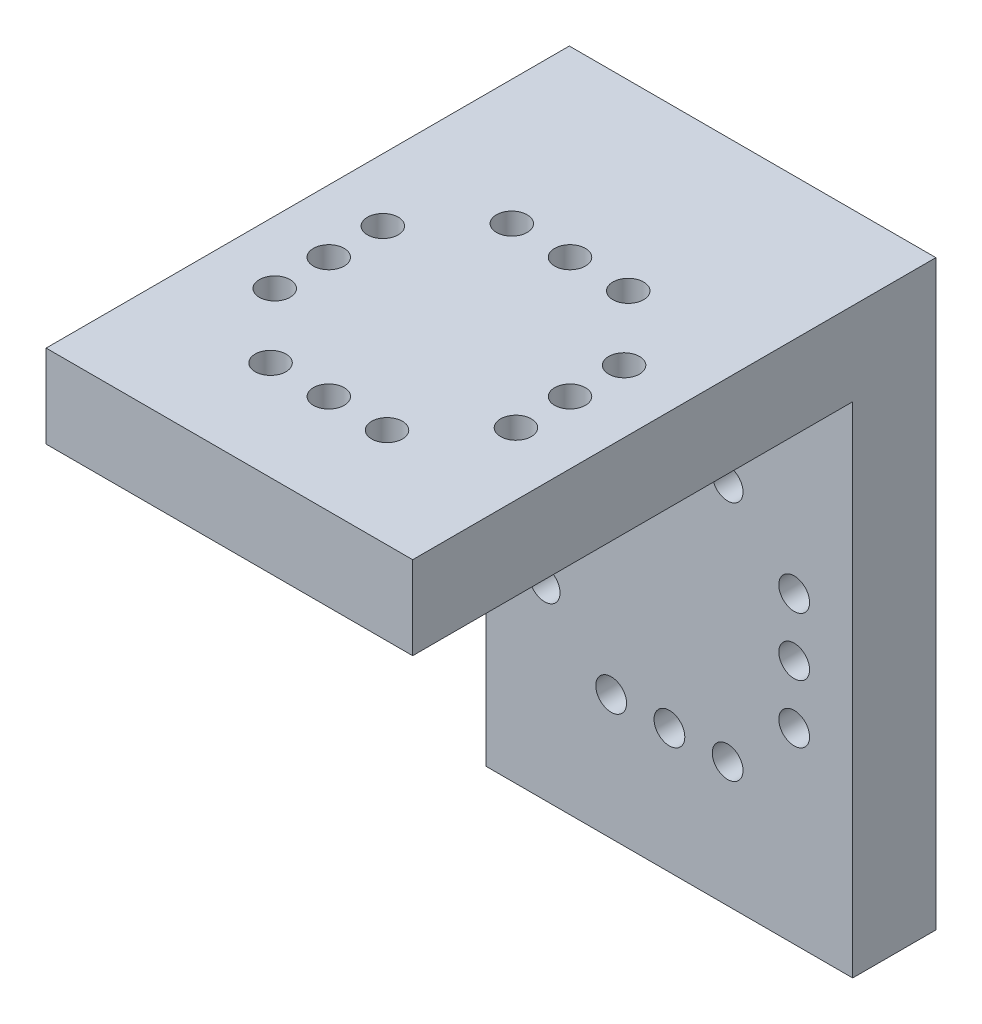
ISO-10303-21;
HEADER;
FILE_DESCRIPTION(('STEP AP214'),'2;1');
FILE_NAME('part.step','',(''),(''),'','','');
FILE_SCHEMA(('AUTOMOTIVE_DESIGN { 1 0 10303 214 1 1 1 1 }'));
ENDSEC;
DATA;
#1=APPLICATION_CONTEXT('core data for automotive mechanical design processes');
#2=APPLICATION_PROTOCOL_DEFINITION('international standard','automotive_design',2000,#1);
#3=PRODUCT_CONTEXT('',#1,'mechanical');
#4=PRODUCT('Part','Part','',(#3));
#5=PRODUCT_RELATED_PRODUCT_CATEGORY('part','',(#4));
#6=PRODUCT_DEFINITION_FORMATION('','',#4);
#7=PRODUCT_DEFINITION_CONTEXT('part definition',#1,'design');
#8=PRODUCT_DEFINITION('design','',#6,#7);
#9=PRODUCT_DEFINITION_SHAPE('','',#8);
#10=(LENGTH_UNIT() NAMED_UNIT(*) SI_UNIT(.MILLI.,.METRE.));
#11=(NAMED_UNIT(*) PLANE_ANGLE_UNIT() SI_UNIT($,.RADIAN.));
#12=(NAMED_UNIT(*) SI_UNIT($,.STERADIAN.) SOLID_ANGLE_UNIT());
#13=UNCERTAINTY_MEASURE_WITH_UNIT(LENGTH_MEASURE(1.E-05),#10,'distance_accuracy_value','');
#14=(GEOMETRIC_REPRESENTATION_CONTEXT(3) GLOBAL_UNCERTAINTY_ASSIGNED_CONTEXT((#13)) GLOBAL_UNIT_ASSIGNED_CONTEXT((#10,
#11,#12)) REPRESENTATION_CONTEXT('',''));
#15=CARTESIAN_POINT('',(0.,0.,0.));
#16=DIRECTION('',(0.,0.,1.));
#17=DIRECTION('',(1.,0.,0.));
#18=AXIS2_PLACEMENT_3D('',#15,#16,#17);
#19=CARTESIAN_POINT('',(-11.016510741559,-5.,0.));
#20=DIRECTION('',(1.,0.,0.));
#21=DIRECTION('',(0.,0.,-1.));
#22=AXIS2_PLACEMENT_3D('',#19,#20,#21);
#23=PLANE('',#22);
#24=DIRECTION('',(0.,0.,-1.));
#25=VECTOR('',#24,1.);
#26=CARTESIAN_POINT('',(-11.016510741559,0.,0.));
#27=LINE('',#26,#25);
#28=CARTESIAN_POINT('',(-11.016510741559,0.,13.224550376675));
#29=VERTEX_POINT('',#28);
#30=CARTESIAN_POINT('',(-11.016510741559,0.,-18.224550376675));
#31=VERTEX_POINT('',#30);
#32=EDGE_CURVE('E140',#29,#31,#27,.T.);
#33=ORIENTED_EDGE('',*,*,#32,.T.);
#34=DIRECTION('',(0.,1.,0.));
#35=VECTOR('',#34,1.);
#36=CARTESIAN_POINT('',(-11.016510741559,-35.,-18.224550376675));
#37=LINE('',#36,#35);
#38=CARTESIAN_POINT('',(-11.016510741559,-35.,-18.224550376675));
#39=VERTEX_POINT('',#38);
#40=EDGE_CURVE('E219',#39,#31,#37,.T.);
#41=ORIENTED_EDGE('',*,*,#40,.F.);
#42=DIRECTION('',(0.,0.,-1.));
#43=VECTOR('',#42,1.);
#44=CARTESIAN_POINT('',(-11.016510741559,-35.,0.));
#45=LINE('',#44,#43);
#46=CARTESIAN_POINT('',(-11.016510741559,-35.,-13.224550376675));
#47=VERTEX_POINT('',#46);
#48=EDGE_CURVE('E216',#47,#39,#45,.T.);
#49=ORIENTED_EDGE('',*,*,#48,.F.);
#50=DIRECTION('',(0.,1.,0.));
#51=VECTOR('',#50,1.);
#52=CARTESIAN_POINT('',(-11.016510741559,-35.,-13.224550376675));
#53=LINE('',#52,#51);
#54=CARTESIAN_POINT('',(-11.016510741559,-5.,-13.224550376675));
#55=VERTEX_POINT('',#54);
#56=EDGE_CURVE('E94',#47,#55,#53,.T.);
#57=ORIENTED_EDGE('',*,*,#56,.T.);
#58=DIRECTION('',(0.,0.,-1.));
#59=VECTOR('',#58,1.);
#60=CARTESIAN_POINT('',(-11.016510741559,-5.,0.));
#61=LINE('',#60,#59);
#62=CARTESIAN_POINT('',(-11.016510741559,-5.,13.224550376675));
#63=VERTEX_POINT('',#62);
#64=EDGE_CURVE('E73',#63,#55,#61,.T.);
#65=ORIENTED_EDGE('',*,*,#64,.F.);
#66=DIRECTION('',(0.,1.,0.));
#67=VECTOR('',#66,1.);
#68=CARTESIAN_POINT('',(-11.016510741559,-5.,13.224550376675));
#69=LINE('',#68,#67);
#70=EDGE_CURVE('E45',#63,#29,#69,.T.);
#71=ORIENTED_EDGE('',*,*,#70,.T.);
#72=EDGE_LOOP('',(#33,#41,#49,#57,#65,#71));
#73=FACE_BOUND('',#72,.T.);
#74=ADVANCED_FACE('F35',(#73),#23,.F.);
#75=CARTESIAN_POINT('',(11.016510741559,-5.,0.));
#76=DIRECTION('',(1.,0.,0.));
#77=DIRECTION('',(0.,0.,-1.));
#78=AXIS2_PLACEMENT_3D('',#75,#76,#77);
#79=PLANE('',#78);
#80=DIRECTION('',(0.,0.,-1.));
#81=VECTOR('',#80,1.);
#82=CARTESIAN_POINT('',(11.016510741559,0.,0.));
#83=LINE('',#82,#81);
#84=CARTESIAN_POINT('',(11.016510741559,0.,13.224550376675));
#85=VERTEX_POINT('',#84);
#86=CARTESIAN_POINT('',(11.016510741559,0.,-18.224550376675));
#87=VERTEX_POINT('',#86);
#88=EDGE_CURVE('E143',#85,#87,#83,.T.);
#89=ORIENTED_EDGE('',*,*,#88,.F.);
#90=DIRECTION('',(0.,1.,0.));
#91=VECTOR('',#90,1.);
#92=CARTESIAN_POINT('',(11.016510741559,-5.,13.224550376675));
#93=LINE('',#92,#91);
#94=CARTESIAN_POINT('',(11.016510741559,-5.,13.224550376675));
#95=VERTEX_POINT('',#94);
#96=EDGE_CURVE('E11',#95,#85,#93,.T.);
#97=ORIENTED_EDGE('',*,*,#96,.F.);
#98=DIRECTION('',(0.,0.,-1.));
#99=VECTOR('',#98,1.);
#100=CARTESIAN_POINT('',(11.016510741559,-5.,0.));
#101=LINE('',#100,#99);
#102=CARTESIAN_POINT('',(11.016510741559,-5.,-13.224550376675));
#103=VERTEX_POINT('',#102);
#104=EDGE_CURVE('E54',#95,#103,#101,.T.);
#105=ORIENTED_EDGE('',*,*,#104,.T.);
#106=DIRECTION('',(0.,1.,0.));
#107=VECTOR('',#106,1.);
#108=CARTESIAN_POINT('',(11.016510741559,-35.,-13.224550376675));
#109=LINE('',#108,#107);
#110=CARTESIAN_POINT('',(11.016510741559,-35.,-13.224550376675));
#111=VERTEX_POINT('',#110);
#112=EDGE_CURVE('E224',#111,#103,#109,.T.);
#113=ORIENTED_EDGE('',*,*,#112,.F.);
#114=DIRECTION('',(0.,0.,-1.));
#115=VECTOR('',#114,1.);
#116=CARTESIAN_POINT('',(11.016510741559,-35.,0.));
#117=LINE('',#116,#115);
#118=CARTESIAN_POINT('',(11.016510741559,-35.,-18.224550376675));
#119=VERTEX_POINT('',#118);
#120=EDGE_CURVE('E212',#111,#119,#117,.T.);
#121=ORIENTED_EDGE('',*,*,#120,.T.);
#122=DIRECTION('',(0.,1.,0.));
#123=VECTOR('',#122,1.);
#124=CARTESIAN_POINT('',(11.016510741559,-35.,-18.224550376675));
#125=LINE('',#124,#123);
#126=EDGE_CURVE('E221',#119,#87,#125,.T.);
#127=ORIENTED_EDGE('',*,*,#126,.T.);
#128=EDGE_LOOP('',(#89,#97,#105,#113,#121,#127));
#129=FACE_BOUND('',#128,.T.);
#130=ADVANCED_FACE('F285',(#129),#79,.T.);
#131=CARTESIAN_POINT('',(-7.25,-5.,-3.25));
#132=DIRECTION('',(0.,1.,0.));
#133=DIRECTION('',(0.,0.,1.));
#134=AXIS2_PLACEMENT_3D('',#131,#132,#133);
#135=CYLINDRICAL_SURFACE('',#134,0.925000000000001);
#136=CARTESIAN_POINT('',(-7.25,-5.,-3.25));
#137=DIRECTION('',(0.,1.,0.));
#138=DIRECTION('',(0.,0.,1.));
#139=AXIS2_PLACEMENT_3D('',#136,#137,#138);
#140=CIRCLE('',#139,0.925000000000001);
#141=CARTESIAN_POINT('',(-7.25,-5.,-2.325));
#142=VERTEX_POINT('',#141);
#143=EDGE_CURVE('E117',#142,#142,#140,.F.);
#144=ORIENTED_EDGE('',*,*,#143,.T.);
#145=EDGE_LOOP('',(#144));
#146=FACE_BOUND('',#145,.T.);
#147=CARTESIAN_POINT('',(-7.25,0.,-3.25));
#148=DIRECTION('',(0.,1.,0.));
#149=DIRECTION('',(0.,0.,1.));
#150=AXIS2_PLACEMENT_3D('',#147,#148,#149);
#151=CIRCLE('',#150,0.925000000000001);
#152=CARTESIAN_POINT('',(-7.25,0.,-2.325));
#153=VERTEX_POINT('',#152);
#154=EDGE_CURVE('E158',#153,#153,#151,.F.);
#155=ORIENTED_EDGE('',*,*,#154,.F.);
#156=EDGE_LOOP('',(#155));
#157=FACE_BOUND('',#156,.T.);
#158=ADVANCED_FACE('F290',(#146,#157),#135,.F.);
#159=CARTESIAN_POINT('',(-7.25,-5.,3.25));
#160=DIRECTION('',(0.,1.,0.));
#161=DIRECTION('',(0.,0.,1.));
#162=AXIS2_PLACEMENT_3D('',#159,#160,#161);
#163=CYLINDRICAL_SURFACE('',#162,0.925000000000001);
#164=CARTESIAN_POINT('',(-7.25,-5.,3.25));
#165=DIRECTION('',(0.,1.,0.));
#166=DIRECTION('',(0.,0.,1.));
#167=AXIS2_PLACEMENT_3D('',#164,#165,#166);
#168=CIRCLE('',#167,0.925000000000001);
#169=CARTESIAN_POINT('',(-7.25,-5.,4.175));
#170=VERTEX_POINT('',#169);
#171=EDGE_CURVE('E114',#170,#170,#168,.T.);
#172=ORIENTED_EDGE('',*,*,#171,.F.);
#173=EDGE_LOOP('',(#172));
#174=FACE_BOUND('',#173,.T.);
#175=CARTESIAN_POINT('',(-7.25,0.,3.25));
#176=DIRECTION('',(0.,1.,0.));
#177=DIRECTION('',(0.,0.,1.));
#178=AXIS2_PLACEMENT_3D('',#175,#176,#177);
#179=CIRCLE('',#178,0.925000000000001);
#180=CARTESIAN_POINT('',(-7.25,0.,4.175));
#181=VERTEX_POINT('',#180);
#182=EDGE_CURVE('E155',#181,#181,#179,.T.);
#183=ORIENTED_EDGE('',*,*,#182,.T.);
#184=EDGE_LOOP('',(#183));
#185=FACE_BOUND('',#184,.T.);
#186=ADVANCED_FACE('F624',(#174,#185),#163,.F.);
#187=CARTESIAN_POINT('',(-7.25,-5.,0.));
#188=DIRECTION('',(0.,1.,0.));
#189=DIRECTION('',(0.,0.,1.));
#190=AXIS2_PLACEMENT_3D('',#187,#188,#189);
#191=CYLINDRICAL_SURFACE('',#190,0.925000000000001);
#192=CARTESIAN_POINT('',(-7.25,-5.,0.));
#193=DIRECTION('',(0.,1.,0.));
#194=DIRECTION('',(0.,0.,1.));
#195=AXIS2_PLACEMENT_3D('',#192,#193,#194);
#196=CIRCLE('',#195,0.925000000000001);
#197=CARTESIAN_POINT('',(-7.25,-5.,0.925000000000002));
#198=VERTEX_POINT('',#197);
#199=EDGE_CURVE('E111',#198,#198,#196,.T.);
#200=ORIENTED_EDGE('',*,*,#199,.F.);
#201=EDGE_LOOP('',(#200));
#202=FACE_BOUND('',#201,.T.);
#203=CARTESIAN_POINT('',(-7.25,0.,0.));
#204=DIRECTION('',(0.,1.,0.));
#205=DIRECTION('',(0.,0.,1.));
#206=AXIS2_PLACEMENT_3D('',#203,#204,#205);
#207=CIRCLE('',#206,0.925000000000001);
#208=CARTESIAN_POINT('',(-7.25,0.,0.925000000000002));
#209=VERTEX_POINT('',#208);
#210=EDGE_CURVE('E152',#209,#209,#207,.T.);
#211=ORIENTED_EDGE('',*,*,#210,.T.);
#212=EDGE_LOOP('',(#211));
#213=FACE_BOUND('',#212,.T.);
#214=ADVANCED_FACE('F631',(#202,#213),#191,.F.);
#215=CARTESIAN_POINT('',(0.,-5.,7.25));
#216=DIRECTION('',(0.,1.,0.));
#217=DIRECTION('',(0.,0.,1.));
#218=AXIS2_PLACEMENT_3D('',#215,#216,#217);
#219=CYLINDRICAL_SURFACE('',#218,0.925);
#220=CARTESIAN_POINT('',(0.,-5.,7.25));
#221=DIRECTION('',(0.,1.,0.));
#222=DIRECTION('',(0.,0.,1.));
#223=AXIS2_PLACEMENT_3D('',#220,#221,#222);
#224=CIRCLE('',#223,0.925);
#225=CARTESIAN_POINT('',(0.,-5.,8.175));
#226=VERTEX_POINT('',#225);
#227=EDGE_CURVE('E108',#226,#226,#224,.F.);
#228=ORIENTED_EDGE('',*,*,#227,.T.);
#229=EDGE_LOOP('',(#228));
#230=FACE_BOUND('',#229,.T.);
#231=CARTESIAN_POINT('',(0.,0.,7.25));
#232=DIRECTION('',(0.,1.,0.));
#233=DIRECTION('',(0.,0.,1.));
#234=AXIS2_PLACEMENT_3D('',#231,#232,#233);
#235=CIRCLE('',#234,0.925);
#236=CARTESIAN_POINT('',(0.,0.,8.175));
#237=VERTEX_POINT('',#236);
#238=EDGE_CURVE('E149',#237,#237,#235,.F.);
#239=ORIENTED_EDGE('',*,*,#238,.F.);
#240=EDGE_LOOP('',(#239));
#241=FACE_BOUND('',#240,.T.);
#242=ADVANCED_FACE('F639',(#230,#241),#219,.F.);
#243=CARTESIAN_POINT('',(3.5,-5.,7.25));
#244=DIRECTION('',(0.,1.,0.));
#245=DIRECTION('',(0.,0.,1.));
#246=AXIS2_PLACEMENT_3D('',#243,#244,#245);
#247=CYLINDRICAL_SURFACE('',#246,0.925);
#248=CARTESIAN_POINT('',(3.5,-5.,7.25));
#249=DIRECTION('',(0.,1.,0.));
#250=DIRECTION('',(0.,0.,1.));
#251=AXIS2_PLACEMENT_3D('',#248,#249,#250);
#252=CIRCLE('',#251,0.925);
#253=CARTESIAN_POINT('',(3.5,-5.,8.175));
#254=VERTEX_POINT('',#253);
#255=EDGE_CURVE('E105',#254,#254,#252,.T.);
#256=ORIENTED_EDGE('',*,*,#255,.F.);
#257=EDGE_LOOP('',(#256));
#258=FACE_BOUND('',#257,.T.);
#259=CARTESIAN_POINT('',(3.5,0.,7.25));
#260=DIRECTION('',(0.,1.,0.));
#261=DIRECTION('',(0.,0.,1.));
#262=AXIS2_PLACEMENT_3D('',#259,#260,#261);
#263=CIRCLE('',#262,0.925);
#264=CARTESIAN_POINT('',(3.5,0.,8.175));
#265=VERTEX_POINT('',#264);
#266=EDGE_CURVE('E146',#265,#265,#263,.T.);
#267=ORIENTED_EDGE('',*,*,#266,.T.);
#268=EDGE_LOOP('',(#267));
#269=FACE_BOUND('',#268,.T.);
#270=ADVANCED_FACE('F647',(#258,#269),#247,.F.);
#271=CARTESIAN_POINT('',(0.,-5.,13.224550376675));
#272=DIRECTION('',(0.,0.,-1.));
#273=DIRECTION('',(-1.,0.,0.));
#274=AXIS2_PLACEMENT_3D('',#271,#272,#273);
#275=PLANE('',#274);
#276=DIRECTION('',(-1.,0.,0.));
#277=VECTOR('',#276,1.);
#278=CARTESIAN_POINT('',(0.,0.,13.224550376675));
#279=LINE('',#278,#277);
#280=EDGE_CURVE('E65',#85,#29,#279,.T.);
#281=ORIENTED_EDGE('',*,*,#280,.T.);
#282=ORIENTED_EDGE('',*,*,#70,.F.);
#283=DIRECTION('',(-1.,0.,0.));
#284=VECTOR('',#283,1.);
#285=CARTESIAN_POINT('',(0.,-5.,13.224550376675));
#286=LINE('',#285,#284);
#287=EDGE_CURVE('E82',#95,#63,#286,.T.);
#288=ORIENTED_EDGE('',*,*,#287,.F.);
#289=ORIENTED_EDGE('',*,*,#96,.T.);
#290=EDGE_LOOP('',(#281,#282,#288,#289));
#291=FACE_BOUND('',#290,.T.);
#292=ADVANCED_FACE('F86',(#291),#275,.F.);
#293=CARTESIAN_POINT('',(0.,-5.,-7.25));
#294=DIRECTION('',(0.,1.,0.));
#295=DIRECTION('',(0.,0.,1.));
#296=AXIS2_PLACEMENT_3D('',#293,#294,#295);
#297=CYLINDRICAL_SURFACE('',#296,0.925);
#298=CARTESIAN_POINT('',(0.,-5.,-7.25));
#299=DIRECTION('',(0.,1.,0.));
#300=DIRECTION('',(0.,0.,1.));
#301=AXIS2_PLACEMENT_3D('',#298,#299,#300);
#302=CIRCLE('',#301,0.925);
#303=CARTESIAN_POINT('',(0.,-5.,-6.325));
#304=VERTEX_POINT('',#303);
#305=EDGE_CURVE('E95',#304,#304,#302,.T.);
#306=ORIENTED_EDGE('',*,*,#305,.F.);
#307=EDGE_LOOP('',(#306));
#308=FACE_BOUND('',#307,.T.);
#309=CARTESIAN_POINT('',(0.,0.,-7.25));
#310=DIRECTION('',(0.,1.,0.));
#311=DIRECTION('',(0.,0.,1.));
#312=AXIS2_PLACEMENT_3D('',#309,#310,#311);
#313=CIRCLE('',#312,0.925);
#314=CARTESIAN_POINT('',(0.,0.,-6.325));
#315=VERTEX_POINT('',#314);
#316=EDGE_CURVE('E137',#315,#315,#313,.T.);
#317=ORIENTED_EDGE('',*,*,#316,.T.);
#318=EDGE_LOOP('',(#317));
#319=FACE_BOUND('',#318,.T.);
#320=ADVANCED_FACE('F246',(#308,#319),#297,.F.);
#321=CARTESIAN_POINT('',(-3.5,-5.,-7.25));
#322=DIRECTION('',(0.,1.,0.));
#323=DIRECTION('',(0.,0.,1.));
#324=AXIS2_PLACEMENT_3D('',#321,#322,#323);
#325=CYLINDRICAL_SURFACE('',#324,0.925);
#326=CARTESIAN_POINT('',(-3.5,-5.,-7.25));
#327=DIRECTION('',(0.,1.,0.));
#328=DIRECTION('',(0.,0.,1.));
#329=AXIS2_PLACEMENT_3D('',#326,#327,#328);
#330=CIRCLE('',#329,0.925);
#331=CARTESIAN_POINT('',(-3.5,-5.,-6.325));
#332=VERTEX_POINT('',#331);
#333=EDGE_CURVE('E98',#332,#332,#330,.T.);
#334=ORIENTED_EDGE('',*,*,#333,.F.);
#335=EDGE_LOOP('',(#334));
#336=FACE_BOUND('',#335,.T.);
#337=CARTESIAN_POINT('',(-3.5,0.,-7.25));
#338=DIRECTION('',(0.,1.,0.));
#339=DIRECTION('',(0.,0.,1.));
#340=AXIS2_PLACEMENT_3D('',#337,#338,#339);
#341=CIRCLE('',#340,0.925);
#342=CARTESIAN_POINT('',(-3.5,0.,-6.325));
#343=VERTEX_POINT('',#342);
#344=EDGE_CURVE('E134',#343,#343,#341,.T.);
#345=ORIENTED_EDGE('',*,*,#344,.T.);
#346=EDGE_LOOP('',(#345));
#347=FACE_BOUND('',#346,.T.);
#348=ADVANCED_FACE('F242',(#336,#347),#325,.F.);
#349=CARTESIAN_POINT('',(3.5,-5.,-7.25));
#350=DIRECTION('',(0.,1.,0.));
#351=DIRECTION('',(0.,0.,1.));
#352=AXIS2_PLACEMENT_3D('',#349,#350,#351);
#353=CYLINDRICAL_SURFACE('',#352,0.925);
#354=CARTESIAN_POINT('',(3.5,-5.,-7.25));
#355=DIRECTION('',(0.,1.,0.));
#356=DIRECTION('',(0.,0.,1.));
#357=AXIS2_PLACEMENT_3D('',#354,#355,#356);
#358=CIRCLE('',#357,0.925);
#359=CARTESIAN_POINT('',(3.5,-5.,-6.325));
#360=VERTEX_POINT('',#359);
#361=EDGE_CURVE('E235',#360,#360,#358,.F.);
#362=ORIENTED_EDGE('',*,*,#361,.T.);
#363=EDGE_LOOP('',(#362));
#364=FACE_BOUND('',#363,.T.);
#365=CARTESIAN_POINT('',(3.5,0.,-7.25));
#366=DIRECTION('',(0.,1.,0.));
#367=DIRECTION('',(0.,0.,1.));
#368=AXIS2_PLACEMENT_3D('',#365,#366,#367);
#369=CIRCLE('',#368,0.925);
#370=CARTESIAN_POINT('',(3.5,0.,-6.325));
#371=VERTEX_POINT('',#370);
#372=EDGE_CURVE('E131',#371,#371,#369,.F.);
#373=ORIENTED_EDGE('',*,*,#372,.F.);
#374=EDGE_LOOP('',(#373));
#375=FACE_BOUND('',#374,.T.);
#376=ADVANCED_FACE('F245',(#364,#375),#353,.F.);
#377=CARTESIAN_POINT('',(-3.5,-5.,7.25));
#378=DIRECTION('',(0.,1.,0.));
#379=DIRECTION('',(0.,0.,1.));
#380=AXIS2_PLACEMENT_3D('',#377,#378,#379);
#381=CYLINDRICAL_SURFACE('',#380,0.925);
#382=CARTESIAN_POINT('',(-3.5,-5.,7.25));
#383=DIRECTION('',(0.,1.,0.));
#384=DIRECTION('',(0.,0.,1.));
#385=AXIS2_PLACEMENT_3D('',#382,#383,#384);
#386=CIRCLE('',#385,0.925);
#387=CARTESIAN_POINT('',(-3.5,-5.,8.175));
#388=VERTEX_POINT('',#387);
#389=EDGE_CURVE('E232',#388,#388,#386,.F.);
#390=ORIENTED_EDGE('',*,*,#389,.T.);
#391=EDGE_LOOP('',(#390));
#392=FACE_BOUND('',#391,.T.);
#393=CARTESIAN_POINT('',(-3.5,0.,7.25));
#394=DIRECTION('',(0.,1.,0.));
#395=DIRECTION('',(0.,0.,1.));
#396=AXIS2_PLACEMENT_3D('',#393,#394,#395);
#397=CIRCLE('',#396,0.925);
#398=CARTESIAN_POINT('',(-3.5,0.,8.175));
#399=VERTEX_POINT('',#398);
#400=EDGE_CURVE('E128',#399,#399,#397,.F.);
#401=ORIENTED_EDGE('',*,*,#400,.F.);
#402=EDGE_LOOP('',(#401));
#403=FACE_BOUND('',#402,.T.);
#404=ADVANCED_FACE('F299',(#392,#403),#381,.F.);
#405=CARTESIAN_POINT('',(7.250000000001,-5.,-3.25));
#406=DIRECTION('',(0.,1.,0.));
#407=DIRECTION('',(0.,0.,1.));
#408=AXIS2_PLACEMENT_3D('',#405,#406,#407);
#409=CYLINDRICAL_SURFACE('',#408,0.925000000000002);
#410=CARTESIAN_POINT('',(7.250000000001,-5.,-3.25));
#411=DIRECTION('',(0.,1.,0.));
#412=DIRECTION('',(0.,0.,1.));
#413=AXIS2_PLACEMENT_3D('',#410,#411,#412);
#414=CIRCLE('',#413,0.925000000000002);
#415=CARTESIAN_POINT('',(7.250000000001,-5.,-2.325));
#416=VERTEX_POINT('',#415);
#417=EDGE_CURVE('E229',#416,#416,#414,.T.);
#418=ORIENTED_EDGE('',*,*,#417,.F.);
#419=EDGE_LOOP('',(#418));
#420=FACE_BOUND('',#419,.T.);
#421=CARTESIAN_POINT('',(7.250000000001,0.,-3.25));
#422=DIRECTION('',(0.,1.,0.));
#423=DIRECTION('',(0.,0.,1.));
#424=AXIS2_PLACEMENT_3D('',#421,#422,#423);
#425=CIRCLE('',#424,0.925000000000002);
#426=CARTESIAN_POINT('',(7.250000000001,0.,-2.325));
#427=VERTEX_POINT('',#426);
#428=EDGE_CURVE('E125',#427,#427,#425,.T.);
#429=ORIENTED_EDGE('',*,*,#428,.T.);
#430=EDGE_LOOP('',(#429));
#431=FACE_BOUND('',#430,.T.);
#432=ADVANCED_FACE('F281',(#420,#431),#409,.F.);
#433=CARTESIAN_POINT('',(7.250000000001,-5.,0.));
#434=DIRECTION('',(0.,1.,0.));
#435=DIRECTION('',(0.,0.,1.));
#436=AXIS2_PLACEMENT_3D('',#433,#434,#435);
#437=CYLINDRICAL_SURFACE('',#436,0.925000000000001);
#438=CARTESIAN_POINT('',(7.250000000001,-5.,0.));
#439=DIRECTION('',(0.,1.,0.));
#440=DIRECTION('',(0.,0.,1.));
#441=AXIS2_PLACEMENT_3D('',#438,#439,#440);
#442=CIRCLE('',#441,0.925000000000001);
#443=CARTESIAN_POINT('',(7.250000000001,-5.,0.925000000000001));
#444=VERTEX_POINT('',#443);
#445=EDGE_CURVE('E163',#444,#444,#442,.F.);
#446=ORIENTED_EDGE('',*,*,#445,.T.);
#447=EDGE_LOOP('',(#446));
#448=FACE_BOUND('',#447,.T.);
#449=CARTESIAN_POINT('',(7.250000000001,0.,0.));
#450=DIRECTION('',(0.,1.,0.));
#451=DIRECTION('',(0.,0.,1.));
#452=AXIS2_PLACEMENT_3D('',#449,#450,#451);
#453=CIRCLE('',#452,0.925000000000001);
#454=CARTESIAN_POINT('',(7.250000000001,0.,0.925000000000001));
#455=VERTEX_POINT('',#454);
#456=EDGE_CURVE('E122',#455,#455,#453,.F.);
#457=ORIENTED_EDGE('',*,*,#456,.F.);
#458=EDGE_LOOP('',(#457));
#459=FACE_BOUND('',#458,.T.);
#460=ADVANCED_FACE('F37',(#448,#459),#437,.F.);
#461=CARTESIAN_POINT('',(7.250000000001,-5.,3.25));
#462=DIRECTION('',(0.,1.,0.));
#463=DIRECTION('',(0.,0.,1.));
#464=AXIS2_PLACEMENT_3D('',#461,#462,#463);
#465=CYLINDRICAL_SURFACE('',#464,0.925000000000001);
#466=CARTESIAN_POINT('',(7.250000000001,-5.,3.25));
#467=DIRECTION('',(0.,1.,0.));
#468=DIRECTION('',(0.,0.,1.));
#469=AXIS2_PLACEMENT_3D('',#466,#467,#468);
#470=CIRCLE('',#469,0.925000000000001);
#471=CARTESIAN_POINT('',(7.250000000001,-5.,4.175));
#472=VERTEX_POINT('',#471);
#473=EDGE_CURVE('E90',#472,#472,#470,.F.);
#474=ORIENTED_EDGE('',*,*,#473,.T.);
#475=EDGE_LOOP('',(#474));
#476=FACE_BOUND('',#475,.T.);
#477=CARTESIAN_POINT('',(7.250000000001,0.,3.25));
#478=DIRECTION('',(0.,1.,0.));
#479=DIRECTION('',(0.,0.,1.));
#480=AXIS2_PLACEMENT_3D('',#477,#478,#479);
#481=CIRCLE('',#480,0.925000000000001);
#482=CARTESIAN_POINT('',(7.250000000001,0.,4.175));
#483=VERTEX_POINT('',#482);
#484=EDGE_CURVE('E161',#483,#483,#481,.F.);
#485=ORIENTED_EDGE('',*,*,#484,.F.);
#486=EDGE_LOOP('',(#485));
#487=FACE_BOUND('',#486,.T.);
#488=ADVANCED_FACE('F271',(#476,#487),#465,.F.);
#489=CARTESIAN_POINT('',(0.,-5.,0.));
#490=DIRECTION('',(0.,1.,0.));
#491=DIRECTION('',(0.,0.,1.));
#492=AXIS2_PLACEMENT_3D('',#489,#490,#491);
#493=PLANE('',#492);
#494=ORIENTED_EDGE('',*,*,#445,.F.);
#495=EDGE_LOOP('',(#494));
#496=FACE_BOUND('',#495,.T.);
#497=ORIENTED_EDGE('',*,*,#417,.T.);
#498=EDGE_LOOP('',(#497));
#499=FACE_BOUND('',#498,.T.);
#500=ORIENTED_EDGE('',*,*,#389,.F.);
#501=EDGE_LOOP('',(#500));
#502=FACE_BOUND('',#501,.T.);
#503=ORIENTED_EDGE('',*,*,#361,.F.);
#504=EDGE_LOOP('',(#503));
#505=FACE_BOUND('',#504,.T.);
#506=ORIENTED_EDGE('',*,*,#333,.T.);
#507=EDGE_LOOP('',(#506));
#508=FACE_BOUND('',#507,.T.);
#509=ORIENTED_EDGE('',*,*,#305,.T.);
#510=EDGE_LOOP('',(#509));
#511=FACE_BOUND('',#510,.T.);
#512=ORIENTED_EDGE('',*,*,#64,.T.);
#513=DIRECTION('',(-1.,0.,0.));
#514=VECTOR('',#513,1.);
#515=CARTESIAN_POINT('',(0.,-5.,-13.224550376675));
#516=LINE('',#515,#514);
#517=EDGE_CURVE('E103',#103,#55,#516,.T.);
#518=ORIENTED_EDGE('',*,*,#517,.F.);
#519=ORIENTED_EDGE('',*,*,#104,.F.);
#520=ORIENTED_EDGE('',*,*,#287,.T.);
#521=EDGE_LOOP('',(#512,#518,#519,#520));
#522=FACE_BOUND('',#521,.T.);
#523=ORIENTED_EDGE('',*,*,#255,.T.);
#524=EDGE_LOOP('',(#523));
#525=FACE_BOUND('',#524,.T.);
#526=ORIENTED_EDGE('',*,*,#227,.F.);
#527=EDGE_LOOP('',(#526));
#528=FACE_BOUND('',#527,.T.);
#529=ORIENTED_EDGE('',*,*,#199,.T.);
#530=EDGE_LOOP('',(#529));
#531=FACE_BOUND('',#530,.T.);
#532=ORIENTED_EDGE('',*,*,#171,.T.);
#533=EDGE_LOOP('',(#532));
#534=FACE_BOUND('',#533,.T.);
#535=ORIENTED_EDGE('',*,*,#143,.F.);
#536=EDGE_LOOP('',(#535));
#537=FACE_BOUND('',#536,.T.);
#538=ORIENTED_EDGE('',*,*,#473,.F.);
#539=EDGE_LOOP('',(#538));
#540=FACE_BOUND('',#539,.T.);
#541=ADVANCED_FACE('F83',(#496,#499,#502,#505,#508,#511,#522,#525,#528,#531,#534,#537,#540),
#493,.F.);
#542=CARTESIAN_POINT('',(0.,0.,0.));
#543=DIRECTION('',(0.,1.,0.));
#544=DIRECTION('',(0.,0.,1.));
#545=AXIS2_PLACEMENT_3D('',#542,#543,#544);
#546=PLANE('',#545);
#547=ORIENTED_EDGE('',*,*,#456,.T.);
#548=EDGE_LOOP('',(#547));
#549=FACE_BOUND('',#548,.T.);
#550=ORIENTED_EDGE('',*,*,#428,.F.);
#551=EDGE_LOOP('',(#550));
#552=FACE_BOUND('',#551,.T.);
#553=ORIENTED_EDGE('',*,*,#400,.T.);
#554=EDGE_LOOP('',(#553));
#555=FACE_BOUND('',#554,.T.);
#556=ORIENTED_EDGE('',*,*,#372,.T.);
#557=EDGE_LOOP('',(#556));
#558=FACE_BOUND('',#557,.T.);
#559=ORIENTED_EDGE('',*,*,#344,.F.);
#560=EDGE_LOOP('',(#559));
#561=FACE_BOUND('',#560,.T.);
#562=ORIENTED_EDGE('',*,*,#316,.F.);
#563=EDGE_LOOP('',(#562));
#564=FACE_BOUND('',#563,.T.);
#565=ORIENTED_EDGE('',*,*,#32,.F.);
#566=ORIENTED_EDGE('',*,*,#280,.F.);
#567=ORIENTED_EDGE('',*,*,#88,.T.);
#568=DIRECTION('',(1.,0.,0.));
#569=VECTOR('',#568,1.);
#570=CARTESIAN_POINT('',(0.,0.,-18.224550376675));
#571=LINE('',#570,#569);
#572=EDGE_CURVE('E200',#31,#87,#571,.T.);
#573=ORIENTED_EDGE('',*,*,#572,.F.);
#574=EDGE_LOOP('',(#565,#566,#567,#573));
#575=FACE_BOUND('',#574,.T.);
#576=ORIENTED_EDGE('',*,*,#266,.F.);
#577=EDGE_LOOP('',(#576));
#578=FACE_BOUND('',#577,.T.);
#579=ORIENTED_EDGE('',*,*,#238,.T.);
#580=EDGE_LOOP('',(#579));
#581=FACE_BOUND('',#580,.T.);
#582=ORIENTED_EDGE('',*,*,#210,.F.);
#583=EDGE_LOOP('',(#582));
#584=FACE_BOUND('',#583,.T.);
#585=ORIENTED_EDGE('',*,*,#182,.F.);
#586=EDGE_LOOP('',(#585));
#587=FACE_BOUND('',#586,.T.);
#588=ORIENTED_EDGE('',*,*,#154,.T.);
#589=EDGE_LOOP('',(#588));
#590=FACE_BOUND('',#589,.T.);
#591=ORIENTED_EDGE('',*,*,#484,.T.);
#592=EDGE_LOOP('',(#591));
#593=FACE_BOUND('',#592,.T.);
#594=ADVANCED_FACE('F250',(#549,#552,#555,#558,#561,#564,#575,#578,#581,#584,#587,#590,#593),
#546,.T.);
#595=CARTESIAN_POINT('',(0.,-35.,-13.224550376675));
#596=DIRECTION('',(0.,0.,-1.));
#597=DIRECTION('',(-1.,0.,0.));
#598=AXIS2_PLACEMENT_3D('',#595,#596,#597);
#599=PLANE('',#598);
#600=CARTESIAN_POINT('',(7.5,-23.75,-13.224550376675));
#601=DIRECTION('',(0.,0.,1.));
#602=DIRECTION('',(1.,0.,0.));
#603=AXIS2_PLACEMENT_3D('',#600,#601,#602);
#604=CIRCLE('',#603,0.925);
#605=CARTESIAN_POINT('',(8.425,-23.75,-13.224550376675));
#606=VERTEX_POINT('',#605);
#607=EDGE_CURVE('E514',#606,#606,#604,.T.);
#608=ORIENTED_EDGE('',*,*,#607,.F.);
#609=EDGE_LOOP('',(#608));
#610=FACE_BOUND('',#609,.T.);
#611=CARTESIAN_POINT('',(7.5,-20.25,-13.224550376675));
#612=DIRECTION('',(0.,0.,1.));
#613=DIRECTION('',(-1.,0.,0.));
#614=AXIS2_PLACEMENT_3D('',#611,#612,#613);
#615=CIRCLE('',#614,0.925);
#616=CARTESIAN_POINT('',(6.575,-20.25,-13.224550376675));
#617=VERTEX_POINT('',#616);
#618=EDGE_CURVE('E515',#617,#617,#615,.T.);
#619=ORIENTED_EDGE('',*,*,#618,.F.);
#620=EDGE_LOOP('',(#619));
#621=FACE_BOUND('',#620,.T.);
#622=CARTESIAN_POINT('',(7.5,-16.75,-13.224550376675));
#623=DIRECTION('',(0.,0.,1.));
#624=DIRECTION('',(-1.,0.,0.));
#625=AXIS2_PLACEMENT_3D('',#622,#623,#624);
#626=CIRCLE('',#625,0.925);
#627=CARTESIAN_POINT('',(6.575,-16.75,-13.224550376675));
#628=VERTEX_POINT('',#627);
#629=EDGE_CURVE('E518',#628,#628,#626,.T.);
#630=ORIENTED_EDGE('',*,*,#629,.F.);
#631=EDGE_LOOP('',(#630));
#632=FACE_BOUND('',#631,.T.);
#633=CARTESIAN_POINT('',(-3.5,-13.,-13.224550376675));
#634=DIRECTION('',(0.,0.,1.));
#635=DIRECTION('',(1.,0.,0.));
#636=AXIS2_PLACEMENT_3D('',#633,#634,#635);
#637=CIRCLE('',#636,0.925);
#638=CARTESIAN_POINT('',(-2.575,-13.,-13.224550376675));
#639=VERTEX_POINT('',#638);
#640=EDGE_CURVE('E523',#639,#639,#637,.T.);
#641=ORIENTED_EDGE('',*,*,#640,.F.);
#642=EDGE_LOOP('',(#641));
#643=FACE_BOUND('',#642,.T.);
#644=CARTESIAN_POINT('',(3.5,-13.,-13.224550376675));
#645=DIRECTION('',(0.,0.,1.));
#646=DIRECTION('',(-1.,0.,0.));
#647=AXIS2_PLACEMENT_3D('',#644,#645,#646);
#648=CIRCLE('',#647,0.925000000000001);
#649=CARTESIAN_POINT('',(2.575,-13.,-13.224550376675));
#650=VERTEX_POINT('',#649);
#651=EDGE_CURVE('E542',#650,#650,#648,.T.);
#652=ORIENTED_EDGE('',*,*,#651,.F.);
#653=EDGE_LOOP('',(#652));
#654=FACE_BOUND('',#653,.T.);
#655=CARTESIAN_POINT('',(3.5,-27.5,-13.224550376675));
#656=DIRECTION('',(0.,0.,1.));
#657=DIRECTION('',(1.,0.,0.));
#658=AXIS2_PLACEMENT_3D('',#655,#656,#657);
#659=CIRCLE('',#658,0.925000000000001);
#660=CARTESIAN_POINT('',(4.425,-27.5,-13.224550376675));
#661=VERTEX_POINT('',#660);
#662=EDGE_CURVE('E546',#661,#661,#659,.T.);
#663=ORIENTED_EDGE('',*,*,#662,.F.);
#664=EDGE_LOOP('',(#663));
#665=FACE_BOUND('',#664,.T.);
#666=CARTESIAN_POINT('',(0.,-27.5,-13.224550376675));
#667=DIRECTION('',(0.,0.,1.));
#668=DIRECTION('',(-1.,0.,0.));
#669=AXIS2_PLACEMENT_3D('',#666,#667,#668);
#670=CIRCLE('',#669,0.924999999999999);
#671=CARTESIAN_POINT('',(-0.924999999999998,-27.5,-13.224550376675));
#672=VERTEX_POINT('',#671);
#673=EDGE_CURVE('E554',#672,#672,#670,.T.);
#674=ORIENTED_EDGE('',*,*,#673,.F.);
#675=EDGE_LOOP('',(#674));
#676=FACE_BOUND('',#675,.T.);
#677=CARTESIAN_POINT('',(-7.5,-23.75,-13.224550376675));
#678=DIRECTION('',(0.,0.,1.));
#679=DIRECTION('',(-1.,0.,0.));
#680=AXIS2_PLACEMENT_3D('',#677,#678,#679);
#681=CIRCLE('',#680,0.925);
#682=CARTESIAN_POINT('',(-8.425,-23.75,-13.224550376675));
#683=VERTEX_POINT('',#682);
#684=EDGE_CURVE('E558',#683,#683,#681,.T.);
#685=ORIENTED_EDGE('',*,*,#684,.F.);
#686=EDGE_LOOP('',(#685));
#687=FACE_BOUND('',#686,.T.);
#688=CARTESIAN_POINT('',(-7.5,-16.75,-13.224550376675));
#689=DIRECTION('',(0.,0.,1.));
#690=DIRECTION('',(1.,0.,0.));
#691=AXIS2_PLACEMENT_3D('',#688,#689,#690);
#692=CIRCLE('',#691,0.925);
#693=CARTESIAN_POINT('',(-6.575,-16.75,-13.224550376675));
#694=VERTEX_POINT('',#693);
#695=EDGE_CURVE('E561',#694,#694,#692,.T.);
#696=ORIENTED_EDGE('',*,*,#695,.F.);
#697=EDGE_LOOP('',(#696));
#698=FACE_BOUND('',#697,.T.);
#699=CARTESIAN_POINT('',(-7.5,-20.25,-13.224550376675));
#700=DIRECTION('',(0.,0.,1.));
#701=DIRECTION('',(1.,0.,0.));
#702=AXIS2_PLACEMENT_3D('',#699,#700,#701);
#703=CIRCLE('',#702,0.925);
#704=CARTESIAN_POINT('',(-6.575,-20.25,-13.224550376675));
#705=VERTEX_POINT('',#704);
#706=EDGE_CURVE('E549',#705,#705,#703,.T.);
#707=ORIENTED_EDGE('',*,*,#706,.F.);
#708=EDGE_LOOP('',(#707));
#709=FACE_BOUND('',#708,.T.);
#710=CARTESIAN_POINT('',(-3.5,-27.5,-13.224550376675));
#711=DIRECTION('',(0.,0.,1.));
#712=DIRECTION('',(-1.,0.,0.));
#713=AXIS2_PLACEMENT_3D('',#710,#711,#712);
#714=CIRCLE('',#713,0.925);
#715=CARTESIAN_POINT('',(-4.425,-27.5,-13.224550376675));
#716=VERTEX_POINT('',#715);
#717=EDGE_CURVE('E556',#716,#716,#714,.T.);
#718=ORIENTED_EDGE('',*,*,#717,.F.);
#719=EDGE_LOOP('',(#718));
#720=FACE_BOUND('',#719,.T.);
#721=CARTESIAN_POINT('',(0.,-13.,-13.224550376675));
#722=DIRECTION('',(0.,0.,1.));
#723=DIRECTION('',(1.,0.,0.));
#724=AXIS2_PLACEMENT_3D('',#721,#722,#723);
#725=CIRCLE('',#724,0.925);
#726=CARTESIAN_POINT('',(0.925000000000001,-13.,-13.224550376675));
#727=VERTEX_POINT('',#726);
#728=EDGE_CURVE('E169',#727,#727,#725,.T.);
#729=ORIENTED_EDGE('',*,*,#728,.F.);
#730=EDGE_LOOP('',(#729));
#731=FACE_BOUND('',#730,.T.);
#732=ORIENTED_EDGE('',*,*,#112,.T.);
#733=ORIENTED_EDGE('',*,*,#517,.T.);
#734=ORIENTED_EDGE('',*,*,#56,.F.);
#735=DIRECTION('',(-1.,0.,0.));
#736=VECTOR('',#735,1.);
#737=CARTESIAN_POINT('',(0.,-35.,-13.224550376675));
#738=LINE('',#737,#736);
#739=EDGE_CURVE('E204',#111,#47,#738,.T.);
#740=ORIENTED_EDGE('',*,*,#739,.F.);
#741=EDGE_LOOP('',(#732,#733,#734,#740));
#742=FACE_BOUND('',#741,.T.);
#743=ADVANCED_FACE('F253',(#610,#621,#632,#643,#654,#665,#676,#687,#698,#709,#720,#731,#742),
#599,.F.);
#744=CARTESIAN_POINT('',(0.,-35.,-18.224550376675));
#745=DIRECTION('',(0.,0.,1.));
#746=DIRECTION('',(1.,0.,0.));
#747=AXIS2_PLACEMENT_3D('',#744,#745,#746);
#748=PLANE('',#747);
#749=CARTESIAN_POINT('',(7.5,-23.75,-18.224550376675));
#750=DIRECTION('',(0.,0.,1.));
#751=DIRECTION('',(1.,0.,0.));
#752=AXIS2_PLACEMENT_3D('',#749,#750,#751);
#753=CIRCLE('',#752,0.925);
#754=CARTESIAN_POINT('',(8.425,-23.75,-18.224550376675));
#755=VERTEX_POINT('',#754);
#756=EDGE_CURVE('E39',#755,#755,#753,.T.);
#757=ORIENTED_EDGE('',*,*,#756,.T.);
#758=EDGE_LOOP('',(#757));
#759=FACE_BOUND('',#758,.T.);
#760=CARTESIAN_POINT('',(7.5,-20.25,-18.224550376675));
#761=DIRECTION('',(0.,0.,1.));
#762=DIRECTION('',(1.,0.,0.));
#763=AXIS2_PLACEMENT_3D('',#760,#761,#762);
#764=CIRCLE('',#763,0.925);
#765=CARTESIAN_POINT('',(8.425,-20.25,-18.224550376675));
#766=VERTEX_POINT('',#765);
#767=EDGE_CURVE('E195',#766,#766,#764,.T.);
#768=ORIENTED_EDGE('',*,*,#767,.T.);
#769=EDGE_LOOP('',(#768));
#770=FACE_BOUND('',#769,.T.);
#771=CARTESIAN_POINT('',(7.5,-16.75,-18.224550376675));
#772=DIRECTION('',(0.,0.,1.));
#773=DIRECTION('',(1.,0.,0.));
#774=AXIS2_PLACEMENT_3D('',#771,#772,#773);
#775=CIRCLE('',#774,0.925);
#776=CARTESIAN_POINT('',(8.425,-16.75,-18.224550376675));
#777=VERTEX_POINT('',#776);
#778=EDGE_CURVE('E193',#777,#777,#775,.T.);
#779=ORIENTED_EDGE('',*,*,#778,.T.);
#780=EDGE_LOOP('',(#779));
#781=FACE_BOUND('',#780,.T.);
#782=CARTESIAN_POINT('',(-3.5,-13.,-18.224550376675));
#783=DIRECTION('',(0.,0.,1.));
#784=DIRECTION('',(1.,0.,0.));
#785=AXIS2_PLACEMENT_3D('',#782,#783,#784);
#786=CIRCLE('',#785,0.925);
#787=CARTESIAN_POINT('',(-2.575,-13.,-18.224550376675));
#788=VERTEX_POINT('',#787);
#789=EDGE_CURVE('E190',#788,#788,#786,.T.);
#790=ORIENTED_EDGE('',*,*,#789,.T.);
#791=EDGE_LOOP('',(#790));
#792=FACE_BOUND('',#791,.T.);
#793=CARTESIAN_POINT('',(3.5,-13.,-18.224550376675));
#794=DIRECTION('',(0.,0.,1.));
#795=DIRECTION('',(1.,0.,0.));
#796=AXIS2_PLACEMENT_3D('',#793,#794,#795);
#797=CIRCLE('',#796,0.925000000000001);
#798=CARTESIAN_POINT('',(4.425,-13.,-18.224550376675));
#799=VERTEX_POINT('',#798);
#800=EDGE_CURVE('E187',#799,#799,#797,.T.);
#801=ORIENTED_EDGE('',*,*,#800,.T.);
#802=EDGE_LOOP('',(#801));
#803=FACE_BOUND('',#802,.T.);
#804=CARTESIAN_POINT('',(3.5,-27.5,-18.224550376675));
#805=DIRECTION('',(0.,0.,1.));
#806=DIRECTION('',(1.,0.,0.));
#807=AXIS2_PLACEMENT_3D('',#804,#805,#806);
#808=CIRCLE('',#807,0.925000000000001);
#809=CARTESIAN_POINT('',(4.425,-27.5,-18.224550376675));
#810=VERTEX_POINT('',#809);
#811=EDGE_CURVE('E184',#810,#810,#808,.T.);
#812=ORIENTED_EDGE('',*,*,#811,.T.);
#813=EDGE_LOOP('',(#812));
#814=FACE_BOUND('',#813,.T.);
#815=CARTESIAN_POINT('',(0.,-27.5,-18.224550376675));
#816=DIRECTION('',(0.,0.,1.));
#817=DIRECTION('',(1.,0.,0.));
#818=AXIS2_PLACEMENT_3D('',#815,#816,#817);
#819=CIRCLE('',#818,0.924999999999999);
#820=CARTESIAN_POINT('',(0.925,-27.5,-18.224550376675));
#821=VERTEX_POINT('',#820);
#822=EDGE_CURVE('E181',#821,#821,#819,.T.);
#823=ORIENTED_EDGE('',*,*,#822,.T.);
#824=EDGE_LOOP('',(#823));
#825=FACE_BOUND('',#824,.T.);
#826=CARTESIAN_POINT('',(-7.5,-23.75,-18.224550376675));
#827=DIRECTION('',(0.,0.,1.));
#828=DIRECTION('',(1.,0.,0.));
#829=AXIS2_PLACEMENT_3D('',#826,#827,#828);
#830=CIRCLE('',#829,0.925);
#831=CARTESIAN_POINT('',(-6.575,-23.75,-18.224550376675));
#832=VERTEX_POINT('',#831);
#833=EDGE_CURVE('E178',#832,#832,#830,.T.);
#834=ORIENTED_EDGE('',*,*,#833,.T.);
#835=EDGE_LOOP('',(#834));
#836=FACE_BOUND('',#835,.T.);
#837=CARTESIAN_POINT('',(-7.5,-16.75,-18.224550376675));
#838=DIRECTION('',(0.,0.,1.));
#839=DIRECTION('',(1.,0.,0.));
#840=AXIS2_PLACEMENT_3D('',#837,#838,#839);
#841=CIRCLE('',#840,0.925);
#842=CARTESIAN_POINT('',(-6.575,-16.75,-18.224550376675));
#843=VERTEX_POINT('',#842);
#844=EDGE_CURVE('E175',#843,#843,#841,.T.);
#845=ORIENTED_EDGE('',*,*,#844,.T.);
#846=EDGE_LOOP('',(#845));
#847=FACE_BOUND('',#846,.T.);
#848=CARTESIAN_POINT('',(-7.5,-20.25,-18.224550376675));
#849=DIRECTION('',(0.,0.,1.));
#850=DIRECTION('',(1.,0.,0.));
#851=AXIS2_PLACEMENT_3D('',#848,#849,#850);
#852=CIRCLE('',#851,0.925);
#853=CARTESIAN_POINT('',(-6.575,-20.25,-18.224550376675));
#854=VERTEX_POINT('',#853);
#855=EDGE_CURVE('E172',#854,#854,#852,.T.);
#856=ORIENTED_EDGE('',*,*,#855,.T.);
#857=EDGE_LOOP('',(#856));
#858=FACE_BOUND('',#857,.T.);
#859=CARTESIAN_POINT('',(-3.5,-27.5,-18.224550376675));
#860=DIRECTION('',(0.,0.,1.));
#861=DIRECTION('',(1.,0.,0.));
#862=AXIS2_PLACEMENT_3D('',#859,#860,#861);
#863=CIRCLE('',#862,0.925);
#864=CARTESIAN_POINT('',(-2.575,-27.5,-18.224550376675));
#865=VERTEX_POINT('',#864);
#866=EDGE_CURVE('E168',#865,#865,#863,.T.);
#867=ORIENTED_EDGE('',*,*,#866,.T.);
#868=EDGE_LOOP('',(#867));
#869=FACE_BOUND('',#868,.T.);
#870=CARTESIAN_POINT('',(0.,-13.,-18.224550376675));
#871=DIRECTION('',(0.,0.,1.));
#872=DIRECTION('',(1.,0.,0.));
#873=AXIS2_PLACEMENT_3D('',#870,#871,#872);
#874=CIRCLE('',#873,0.925);
#875=CARTESIAN_POINT('',(0.925000000000001,-13.,-18.224550376675));
#876=VERTEX_POINT('',#875);
#877=EDGE_CURVE('E165',#876,#876,#874,.T.);
#878=ORIENTED_EDGE('',*,*,#877,.T.);
#879=EDGE_LOOP('',(#878));
#880=FACE_BOUND('',#879,.T.);
#881=ORIENTED_EDGE('',*,*,#572,.T.);
#882=ORIENTED_EDGE('',*,*,#126,.F.);
#883=DIRECTION('',(1.,0.,0.));
#884=VECTOR('',#883,1.);
#885=CARTESIAN_POINT('',(0.,-35.,-18.224550376675));
#886=LINE('',#885,#884);
#887=EDGE_CURVE('E526',#39,#119,#886,.T.);
#888=ORIENTED_EDGE('',*,*,#887,.F.);
#889=ORIENTED_EDGE('',*,*,#40,.T.);
#890=EDGE_LOOP('',(#881,#882,#888,#889));
#891=FACE_BOUND('',#890,.T.);
#892=ADVANCED_FACE('F371',(#759,#770,#781,#792,#803,#814,#825,#836,#847,#858,#869,#880,#891),
#748,.F.);
#893=CARTESIAN_POINT('',(0.,-35.,0.));
#894=DIRECTION('',(0.,1.,0.));
#895=DIRECTION('',(0.,0.,1.));
#896=AXIS2_PLACEMENT_3D('',#893,#894,#895);
#897=PLANE('',#896);
#898=ORIENTED_EDGE('',*,*,#739,.T.);
#899=ORIENTED_EDGE('',*,*,#48,.T.);
#900=ORIENTED_EDGE('',*,*,#887,.T.);
#901=ORIENTED_EDGE('',*,*,#120,.F.);
#902=EDGE_LOOP('',(#898,#899,#900,#901));
#903=FACE_BOUND('',#902,.T.);
#904=ADVANCED_FACE('F365',(#903),#897,.F.);
#905=CARTESIAN_POINT('',(0.,-13.,-38.224550376675));
#906=DIRECTION('',(0.,0.,1.));
#907=DIRECTION('',(1.,0.,0.));
#908=AXIS2_PLACEMENT_3D('',#905,#906,#907);
#909=CYLINDRICAL_SURFACE('',#908,0.925);
#910=ORIENTED_EDGE('',*,*,#728,.T.);
#911=EDGE_LOOP('',(#910));
#912=FACE_BOUND('',#911,.T.);
#913=ORIENTED_EDGE('',*,*,#877,.F.);
#914=EDGE_LOOP('',(#913));
#915=FACE_BOUND('',#914,.T.);
#916=ADVANCED_FACE('F370',(#912,#915),#909,.F.);
#917=CARTESIAN_POINT('',(-3.5,-27.5,-38.224550376675));
#918=DIRECTION('',(0.,0.,1.));
#919=DIRECTION('',(1.,0.,0.));
#920=AXIS2_PLACEMENT_3D('',#917,#918,#919);
#921=CYLINDRICAL_SURFACE('',#920,0.925);
#922=ORIENTED_EDGE('',*,*,#717,.T.);
#923=EDGE_LOOP('',(#922));
#924=FACE_BOUND('',#923,.T.);
#925=ORIENTED_EDGE('',*,*,#866,.F.);
#926=EDGE_LOOP('',(#925));
#927=FACE_BOUND('',#926,.T.);
#928=ADVANCED_FACE('F397',(#924,#927),#921,.F.);
#929=CARTESIAN_POINT('',(-7.5,-20.25,-38.224550376675));
#930=DIRECTION('',(0.,0.,1.));
#931=DIRECTION('',(1.,0.,0.));
#932=AXIS2_PLACEMENT_3D('',#929,#930,#931);
#933=CYLINDRICAL_SURFACE('',#932,0.925);
#934=ORIENTED_EDGE('',*,*,#706,.T.);
#935=EDGE_LOOP('',(#934));
#936=FACE_BOUND('',#935,.T.);
#937=ORIENTED_EDGE('',*,*,#855,.F.);
#938=EDGE_LOOP('',(#937));
#939=FACE_BOUND('',#938,.T.);
#940=ADVANCED_FACE('F407',(#936,#939),#933,.F.);
#941=CARTESIAN_POINT('',(-7.5,-16.75,-38.224550376675));
#942=DIRECTION('',(0.,0.,1.));
#943=DIRECTION('',(1.,0.,0.));
#944=AXIS2_PLACEMENT_3D('',#941,#942,#943);
#945=CYLINDRICAL_SURFACE('',#944,0.925);
#946=ORIENTED_EDGE('',*,*,#695,.T.);
#947=EDGE_LOOP('',(#946));
#948=FACE_BOUND('',#947,.T.);
#949=ORIENTED_EDGE('',*,*,#844,.F.);
#950=EDGE_LOOP('',(#949));
#951=FACE_BOUND('',#950,.T.);
#952=ADVANCED_FACE('F417',(#948,#951),#945,.F.);
#953=CARTESIAN_POINT('',(-7.5,-23.75,-38.224550376675));
#954=DIRECTION('',(0.,0.,1.));
#955=DIRECTION('',(1.,0.,0.));
#956=AXIS2_PLACEMENT_3D('',#953,#954,#955);
#957=CYLINDRICAL_SURFACE('',#956,0.925);
#958=ORIENTED_EDGE('',*,*,#684,.T.);
#959=EDGE_LOOP('',(#958));
#960=FACE_BOUND('',#959,.T.);
#961=ORIENTED_EDGE('',*,*,#833,.F.);
#962=EDGE_LOOP('',(#961));
#963=FACE_BOUND('',#962,.T.);
#964=ADVANCED_FACE('F427',(#960,#963),#957,.F.);
#965=CARTESIAN_POINT('',(0.,-27.5,-38.224550376675));
#966=DIRECTION('',(0.,0.,1.));
#967=DIRECTION('',(1.,0.,0.));
#968=AXIS2_PLACEMENT_3D('',#965,#966,#967);
#969=CYLINDRICAL_SURFACE('',#968,0.924999999999999);
#970=ORIENTED_EDGE('',*,*,#673,.T.);
#971=EDGE_LOOP('',(#970));
#972=FACE_BOUND('',#971,.T.);
#973=ORIENTED_EDGE('',*,*,#822,.F.);
#974=EDGE_LOOP('',(#973));
#975=FACE_BOUND('',#974,.T.);
#976=ADVANCED_FACE('F437',(#972,#975),#969,.F.);
#977=CARTESIAN_POINT('',(3.5,-27.5,-38.224550376675));
#978=DIRECTION('',(0.,0.,1.));
#979=DIRECTION('',(1.,0.,0.));
#980=AXIS2_PLACEMENT_3D('',#977,#978,#979);
#981=CYLINDRICAL_SURFACE('',#980,0.925000000000001);
#982=ORIENTED_EDGE('',*,*,#662,.T.);
#983=EDGE_LOOP('',(#982));
#984=FACE_BOUND('',#983,.T.);
#985=ORIENTED_EDGE('',*,*,#811,.F.);
#986=EDGE_LOOP('',(#985));
#987=FACE_BOUND('',#986,.T.);
#988=ADVANCED_FACE('F447',(#984,#987),#981,.F.);
#989=CARTESIAN_POINT('',(3.5,-13.,-38.224550376675));
#990=DIRECTION('',(0.,0.,1.));
#991=DIRECTION('',(1.,0.,0.));
#992=AXIS2_PLACEMENT_3D('',#989,#990,#991);
#993=CYLINDRICAL_SURFACE('',#992,0.925000000000001);
#994=ORIENTED_EDGE('',*,*,#651,.T.);
#995=EDGE_LOOP('',(#994));
#996=FACE_BOUND('',#995,.T.);
#997=ORIENTED_EDGE('',*,*,#800,.F.);
#998=EDGE_LOOP('',(#997));
#999=FACE_BOUND('',#998,.T.);
#1000=ADVANCED_FACE('F457',(#996,#999),#993,.F.);
#1001=CARTESIAN_POINT('',(-3.5,-13.,-38.224550376675));
#1002=DIRECTION('',(0.,0.,1.));
#1003=DIRECTION('',(1.,0.,0.));
#1004=AXIS2_PLACEMENT_3D('',#1001,#1002,#1003);
#1005=CYLINDRICAL_SURFACE('',#1004,0.925);
#1006=ORIENTED_EDGE('',*,*,#640,.T.);
#1007=EDGE_LOOP('',(#1006));
#1008=FACE_BOUND('',#1007,.T.);
#1009=ORIENTED_EDGE('',*,*,#789,.F.);
#1010=EDGE_LOOP('',(#1009));
#1011=FACE_BOUND('',#1010,.T.);
#1012=ADVANCED_FACE('F467',(#1008,#1011),#1005,.F.);
#1013=CARTESIAN_POINT('',(7.5,-16.75,-38.224550376675));
#1014=DIRECTION('',(0.,0.,1.));
#1015=DIRECTION('',(1.,0.,0.));
#1016=AXIS2_PLACEMENT_3D('',#1013,#1014,#1015);
#1017=CYLINDRICAL_SURFACE('',#1016,0.925);
#1018=ORIENTED_EDGE('',*,*,#629,.T.);
#1019=EDGE_LOOP('',(#1018));
#1020=FACE_BOUND('',#1019,.T.);
#1021=ORIENTED_EDGE('',*,*,#778,.F.);
#1022=EDGE_LOOP('',(#1021));
#1023=FACE_BOUND('',#1022,.T.);
#1024=ADVANCED_FACE('F477',(#1020,#1023),#1017,.F.);
#1025=CARTESIAN_POINT('',(7.5,-20.25,-38.224550376675));
#1026=DIRECTION('',(0.,0.,1.));
#1027=DIRECTION('',(1.,0.,0.));
#1028=AXIS2_PLACEMENT_3D('',#1025,#1026,#1027);
#1029=CYLINDRICAL_SURFACE('',#1028,0.925);
#1030=ORIENTED_EDGE('',*,*,#618,.T.);
#1031=EDGE_LOOP('',(#1030));
#1032=FACE_BOUND('',#1031,.T.);
#1033=ORIENTED_EDGE('',*,*,#767,.F.);
#1034=EDGE_LOOP('',(#1033));
#1035=FACE_BOUND('',#1034,.T.);
#1036=ADVANCED_FACE('F487',(#1032,#1035),#1029,.F.);
#1037=CARTESIAN_POINT('',(7.5,-23.75,-38.224550376675));
#1038=DIRECTION('',(0.,0.,1.));
#1039=DIRECTION('',(1.,0.,0.));
#1040=AXIS2_PLACEMENT_3D('',#1037,#1038,#1039);
#1041=CYLINDRICAL_SURFACE('',#1040,0.925);
#1042=ORIENTED_EDGE('',*,*,#607,.T.);
#1043=EDGE_LOOP('',(#1042));
#1044=FACE_BOUND('',#1043,.T.);
#1045=ORIENTED_EDGE('',*,*,#756,.F.);
#1046=EDGE_LOOP('',(#1045));
#1047=FACE_BOUND('',#1046,.T.);
#1048=ADVANCED_FACE('F497',(#1044,#1047),#1041,.F.);
#1049=CLOSED_SHELL('',(#74,#130,#158,#186,#214,#242,#270,#292,#320,#348,#376,#404,#432,#460,
#488,#541,#594,#743,#892,#904,#916,#928,#940,#952,#964,#976,#988,#1000,#1012,#1024,#1036,#1048));
#1050=MANIFOLD_SOLID_BREP('B2',#1049);
#1051=ADVANCED_BREP_SHAPE_REPRESENTATION('',(#18,#1050),#14);
#1052=SHAPE_DEFINITION_REPRESENTATION(#9,#1051);
ENDSEC;
END-ISO-10303-21;
